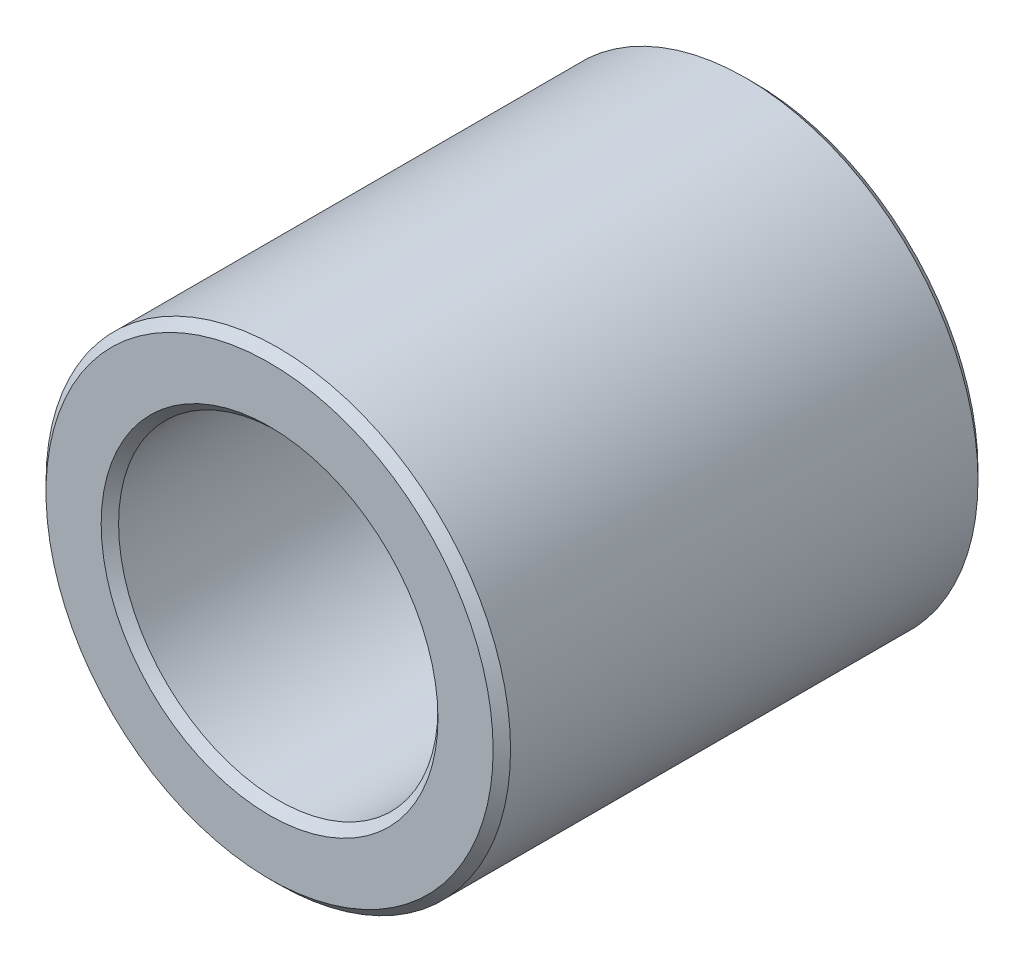
ISO-10303-21;
HEADER;
FILE_DESCRIPTION(('STEP AP214'),'2;1');
FILE_NAME('part.step','',(''),(''),'','','');
FILE_SCHEMA(('AUTOMOTIVE_DESIGN { 1 0 10303 214 1 1 1 1 }'));
ENDSEC;
DATA;
#1=APPLICATION_CONTEXT('core data for automotive mechanical design processes');
#2=APPLICATION_PROTOCOL_DEFINITION('international standard','automotive_design',2000,#1);
#3=PRODUCT_CONTEXT('',#1,'mechanical');
#4=PRODUCT('Part','Part','',(#3));
#5=PRODUCT_RELATED_PRODUCT_CATEGORY('part','',(#4));
#6=PRODUCT_DEFINITION_FORMATION('','',#4);
#7=PRODUCT_DEFINITION_CONTEXT('part definition',#1,'design');
#8=PRODUCT_DEFINITION('design','',#6,#7);
#9=PRODUCT_DEFINITION_SHAPE('','',#8);
#10=(LENGTH_UNIT() NAMED_UNIT(*) SI_UNIT(.MILLI.,.METRE.));
#11=(NAMED_UNIT(*) PLANE_ANGLE_UNIT() SI_UNIT($,.RADIAN.));
#12=(NAMED_UNIT(*) SI_UNIT($,.STERADIAN.) SOLID_ANGLE_UNIT());
#13=UNCERTAINTY_MEASURE_WITH_UNIT(LENGTH_MEASURE(1.E-05),#10,'distance_accuracy_value','');
#14=(GEOMETRIC_REPRESENTATION_CONTEXT(3) GLOBAL_UNCERTAINTY_ASSIGNED_CONTEXT((#13)) GLOBAL_UNIT_ASSIGNED_CONTEXT((#10,
#11,#12)) REPRESENTATION_CONTEXT('',''));
#15=CARTESIAN_POINT('',(0.,0.,0.));
#16=DIRECTION('',(0.,0.,1.));
#17=DIRECTION('',(1.,0.,0.));
#18=AXIS2_PLACEMENT_3D('',#15,#16,#17);
#19=CARTESIAN_POINT('',(0.,0.,8.35));
#20=DIRECTION('',(0.,0.,1.));
#21=DIRECTION('',(1.,0.,0.));
#22=AXIS2_PLACEMENT_3D('',#19,#20,#21);
#23=PLANE('',#22);
#24=CARTESIAN_POINT('',(0.,0.,8.35));
#25=DIRECTION('',(0.,0.,1.));
#26=DIRECTION('',(1.,0.,0.));
#27=AXIS2_PLACEMENT_3D('',#24,#25,#26);
#28=CIRCLE('',#27,2.9);
#29=CARTESIAN_POINT('',(2.9,0.,8.35));
#30=VERTEX_POINT('',#29);
#31=EDGE_CURVE('E10',#30,#30,#28,.F.);
#32=ORIENTED_EDGE('',*,*,#31,.T.);
#33=EDGE_LOOP('',(#32));
#34=FACE_BOUND('',#33,.T.);
#35=CARTESIAN_POINT('',(0.,0.,8.35));
#36=DIRECTION('',(0.,0.,1.));
#37=DIRECTION('',(1.,0.,0.));
#38=AXIS2_PLACEMENT_3D('',#35,#36,#37);
#39=CIRCLE('',#38,3.85);
#40=CARTESIAN_POINT('',(3.85,0.,8.35));
#41=VERTEX_POINT('',#40);
#42=EDGE_CURVE('E22',#41,#41,#39,.T.);
#43=ORIENTED_EDGE('',*,*,#42,.T.);
#44=EDGE_LOOP('',(#43));
#45=FACE_BOUND('',#44,.T.);
#46=ADVANCED_FACE('F15',(#34,#45),#23,.T.);
#47=CARTESIAN_POINT('',(0.,0.,0.));
#48=DIRECTION('',(0.,0.,1.));
#49=DIRECTION('',(1.,0.,0.));
#50=AXIS2_PLACEMENT_3D('',#47,#48,#49);
#51=PLANE('',#50);
#52=CARTESIAN_POINT('',(0.,0.,0.));
#53=DIRECTION('',(0.,0.,1.));
#54=DIRECTION('',(1.,0.,0.));
#55=AXIS2_PLACEMENT_3D('',#52,#53,#54);
#56=CIRCLE('',#55,2.9);
#57=CARTESIAN_POINT('',(2.9,0.,0.));
#58=VERTEX_POINT('',#57);
#59=EDGE_CURVE('E41',#58,#58,#56,.T.);
#60=ORIENTED_EDGE('',*,*,#59,.T.);
#61=EDGE_LOOP('',(#60));
#62=FACE_BOUND('',#61,.T.);
#63=CARTESIAN_POINT('',(0.,0.,0.));
#64=DIRECTION('',(0.,0.,1.));
#65=DIRECTION('',(1.,0.,0.));
#66=AXIS2_PLACEMENT_3D('',#63,#64,#65);
#67=CIRCLE('',#66,3.85);
#68=CARTESIAN_POINT('',(3.85,0.,0.));
#69=VERTEX_POINT('',#68);
#70=EDGE_CURVE('E42',#69,#69,#67,.F.);
#71=ORIENTED_EDGE('',*,*,#70,.T.);
#72=EDGE_LOOP('',(#71));
#73=FACE_BOUND('',#72,.T.);
#74=ADVANCED_FACE('F48',(#62,#73),#51,.F.);
#75=CARTESIAN_POINT('',(0.,0.,8.35));
#76=DIRECTION('',(0.,0.,-1.));
#77=DIRECTION('',(-1.,0.,0.));
#78=AXIS2_PLACEMENT_3D('',#75,#76,#77);
#79=CYLINDRICAL_SURFACE('',#78,4.);
#80=CARTESIAN_POINT('',(0.,0.,0.15));
#81=DIRECTION('',(0.,0.,1.));
#82=DIRECTION('',(1.,0.,0.));
#83=AXIS2_PLACEMENT_3D('',#80,#81,#82);
#84=CIRCLE('',#83,4.);
#85=CARTESIAN_POINT('',(4.,0.,0.15));
#86=VERTEX_POINT('',#85);
#87=EDGE_CURVE('E27',#86,#86,#84,.T.);
#88=ORIENTED_EDGE('',*,*,#87,.T.);
#89=EDGE_LOOP('',(#88));
#90=FACE_BOUND('',#89,.T.);
#91=CARTESIAN_POINT('',(0.,0.,8.2));
#92=DIRECTION('',(0.,0.,1.));
#93=DIRECTION('',(1.,0.,0.));
#94=AXIS2_PLACEMENT_3D('',#91,#92,#93);
#95=CIRCLE('',#94,4.);
#96=CARTESIAN_POINT('',(4.,0.,8.2));
#97=VERTEX_POINT('',#96);
#98=EDGE_CURVE('E28',#97,#97,#95,.F.);
#99=ORIENTED_EDGE('',*,*,#98,.T.);
#100=EDGE_LOOP('',(#99));
#101=FACE_BOUND('',#100,.T.);
#102=ADVANCED_FACE('F59',(#90,#101),#79,.T.);
#103=CARTESIAN_POINT('',(0.,0.,8.35));
#104=DIRECTION('',(0.,0.,-1.));
#105=DIRECTION('',(-1.,0.,0.));
#106=AXIS2_PLACEMENT_3D('',#103,#104,#105);
#107=CYLINDRICAL_SURFACE('',#106,2.75);
#108=CARTESIAN_POINT('',(0.,0.,0.15));
#109=DIRECTION('',(0.,0.,1.));
#110=DIRECTION('',(1.,0.,0.));
#111=AXIS2_PLACEMENT_3D('',#108,#109,#110);
#112=CIRCLE('',#111,2.75);
#113=CARTESIAN_POINT('',(2.75,0.,0.15));
#114=VERTEX_POINT('',#113);
#115=EDGE_CURVE('E34',#114,#114,#112,.F.);
#116=ORIENTED_EDGE('',*,*,#115,.T.);
#117=EDGE_LOOP('',(#116));
#118=FACE_BOUND('',#117,.T.);
#119=CARTESIAN_POINT('',(0.,0.,8.2));
#120=DIRECTION('',(0.,0.,1.));
#121=DIRECTION('',(1.,0.,0.));
#122=AXIS2_PLACEMENT_3D('',#119,#120,#121);
#123=CIRCLE('',#122,2.75);
#124=CARTESIAN_POINT('',(2.75,0.,8.2));
#125=VERTEX_POINT('',#124);
#126=EDGE_CURVE('E36',#125,#125,#123,.T.);
#127=ORIENTED_EDGE('',*,*,#126,.T.);
#128=EDGE_LOOP('',(#127));
#129=FACE_BOUND('',#128,.T.);
#130=ADVANCED_FACE('F61',(#118,#129),#107,.F.);
#131=CARTESIAN_POINT('',(0.,0.,0.));
#132=DIRECTION('',(0.,0.,-1.));
#133=DIRECTION('',(-1.,0.,0.));
#134=AXIS2_PLACEMENT_3D('',#131,#132,#133);
#135=CONICAL_SURFACE('',#134,2.9,0.785398163397442);
#136=ORIENTED_EDGE('',*,*,#115,.F.);
#137=EDGE_LOOP('',(#136));
#138=FACE_BOUND('',#137,.T.);
#139=ORIENTED_EDGE('',*,*,#59,.F.);
#140=EDGE_LOOP('',(#139));
#141=FACE_BOUND('',#140,.T.);
#142=ADVANCED_FACE('F53',(#138,#141),#135,.F.);
#143=CARTESIAN_POINT('',(0.,0.,0.15));
#144=DIRECTION('',(0.,0.,1.));
#145=DIRECTION('',(1.,0.,0.));
#146=AXIS2_PLACEMENT_3D('',#143,#144,#145);
#147=CONICAL_SURFACE('',#146,4.,0.785398163397451);
#148=ORIENTED_EDGE('',*,*,#70,.F.);
#149=EDGE_LOOP('',(#148));
#150=FACE_BOUND('',#149,.T.);
#151=ORIENTED_EDGE('',*,*,#87,.F.);
#152=EDGE_LOOP('',(#151));
#153=FACE_BOUND('',#152,.T.);
#154=ADVANCED_FACE('F49',(#150,#153),#147,.T.);
#155=CARTESIAN_POINT('',(0.,0.,8.2));
#156=DIRECTION('',(0.,0.,1.));
#157=DIRECTION('',(1.,0.,0.));
#158=AXIS2_PLACEMENT_3D('',#155,#156,#157);
#159=CONICAL_SURFACE('',#158,2.75,0.785398163397446);
#160=ORIENTED_EDGE('',*,*,#31,.F.);
#161=EDGE_LOOP('',(#160));
#162=FACE_BOUND('',#161,.T.);
#163=ORIENTED_EDGE('',*,*,#126,.F.);
#164=EDGE_LOOP('',(#163));
#165=FACE_BOUND('',#164,.T.);
#166=ADVANCED_FACE('F52',(#162,#165),#159,.F.);
#167=CARTESIAN_POINT('',(0.,0.,8.35));
#168=DIRECTION('',(0.,0.,-1.));
#169=DIRECTION('',(-1.,0.,0.));
#170=AXIS2_PLACEMENT_3D('',#167,#168,#169);
#171=CONICAL_SURFACE('',#170,3.85,0.785398163397442);
#172=ORIENTED_EDGE('',*,*,#98,.F.);
#173=EDGE_LOOP('',(#172));
#174=FACE_BOUND('',#173,.T.);
#175=ORIENTED_EDGE('',*,*,#42,.F.);
#176=EDGE_LOOP('',(#175));
#177=FACE_BOUND('',#176,.T.);
#178=ADVANCED_FACE('F17',(#174,#177),#171,.T.);
#179=CLOSED_SHELL('',(#46,#74,#102,#130,#142,#154,#166,#178));
#180=MANIFOLD_SOLID_BREP('B1',#179);
#181=ADVANCED_BREP_SHAPE_REPRESENTATION('',(#18,#180),#14);
#182=SHAPE_DEFINITION_REPRESENTATION(#9,#181);
ENDSEC;
END-ISO-10303-21;
